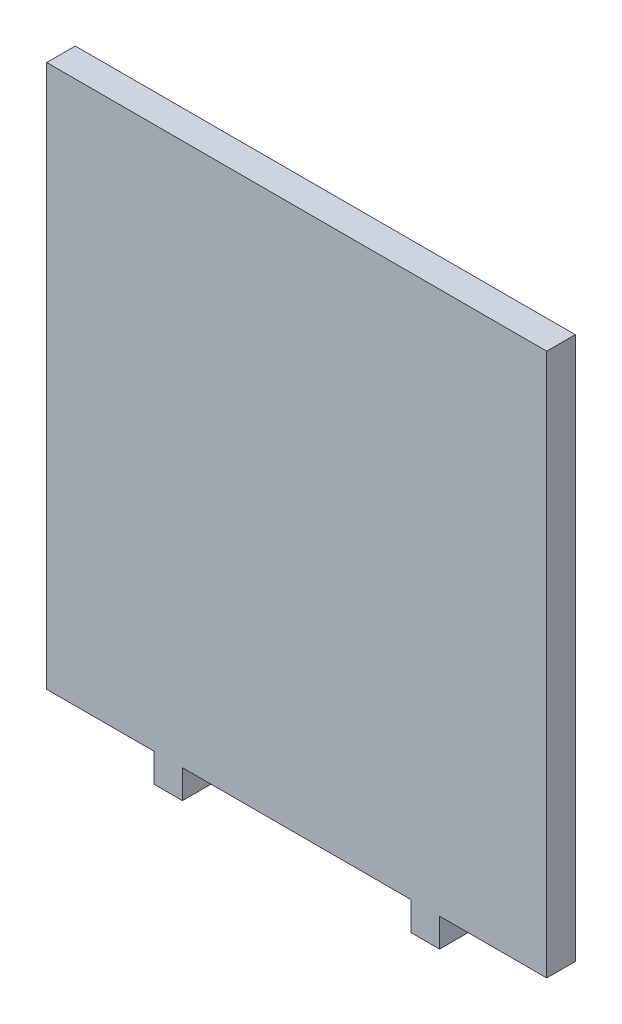
ISO-10303-21;
HEADER;
FILE_DESCRIPTION(('STEP AP214'),'2;1');
FILE_NAME('part.step','',(''),(''),'','','');
FILE_SCHEMA(('AUTOMOTIVE_DESIGN { 1 0 10303 214 1 1 1 1 }'));
ENDSEC;
DATA;
#1=APPLICATION_CONTEXT('core data for automotive mechanical design processes');
#2=APPLICATION_PROTOCOL_DEFINITION('international standard','automotive_design',2000,#1);
#3=PRODUCT_CONTEXT('',#1,'mechanical');
#4=PRODUCT('Part','Part','',(#3));
#5=PRODUCT_RELATED_PRODUCT_CATEGORY('part','',(#4));
#6=PRODUCT_DEFINITION_FORMATION('','',#4);
#7=PRODUCT_DEFINITION_CONTEXT('part definition',#1,'design');
#8=PRODUCT_DEFINITION('design','',#6,#7);
#9=PRODUCT_DEFINITION_SHAPE('','',#8);
#10=(LENGTH_UNIT() NAMED_UNIT(*) SI_UNIT(.MILLI.,.METRE.));
#11=(NAMED_UNIT(*) PLANE_ANGLE_UNIT() SI_UNIT($,.RADIAN.));
#12=(NAMED_UNIT(*) SI_UNIT($,.STERADIAN.) SOLID_ANGLE_UNIT());
#13=UNCERTAINTY_MEASURE_WITH_UNIT(LENGTH_MEASURE(1.E-05),#10,'distance_accuracy_value','');
#14=(GEOMETRIC_REPRESENTATION_CONTEXT(3) GLOBAL_UNCERTAINTY_ASSIGNED_CONTEXT((#13)) GLOBAL_UNIT_ASSIGNED_CONTEXT((#10,
#11,#12)) REPRESENTATION_CONTEXT('',''));
#15=CARTESIAN_POINT('',(0.,0.,0.));
#16=DIRECTION('',(0.,0.,1.));
#17=DIRECTION('',(1.,0.,0.));
#18=AXIS2_PLACEMENT_3D('',#15,#16,#17);
#19=CARTESIAN_POINT('',(-35.,-38.,4.));
#20=DIRECTION('',(1.,0.,0.));
#21=DIRECTION('',(0.,0.,-1.));
#22=AXIS2_PLACEMENT_3D('',#19,#20,#21);
#23=PLANE('',#22);
#24=DIRECTION('',(0.,-1.,0.));
#25=VECTOR('',#24,1.);
#26=CARTESIAN_POINT('',(-35.,-38.,0.));
#27=LINE('',#26,#25);
#28=CARTESIAN_POINT('',(-35.,38.,0.));
#29=VERTEX_POINT('',#28);
#30=CARTESIAN_POINT('',(-35.,-38.,0.));
#31=VERTEX_POINT('',#30);
#32=EDGE_CURVE('E153',#29,#31,#27,.T.);
#33=ORIENTED_EDGE('',*,*,#32,.T.);
#34=DIRECTION('',(0.,0.,-1.));
#35=VECTOR('',#34,1.);
#36=CARTESIAN_POINT('',(-35.,-38.,4.));
#37=LINE('',#36,#35);
#38=CARTESIAN_POINT('',(-35.,-38.,4.));
#39=VERTEX_POINT('',#38);
#40=EDGE_CURVE('E11',#39,#31,#37,.T.);
#41=ORIENTED_EDGE('',*,*,#40,.F.);
#42=DIRECTION('',(0.,-1.,0.));
#43=VECTOR('',#42,1.);
#44=CARTESIAN_POINT('',(-35.,-38.,4.));
#45=LINE('',#44,#43);
#46=CARTESIAN_POINT('',(-35.,38.,4.));
#47=VERTEX_POINT('',#46);
#48=EDGE_CURVE('E175',#47,#39,#45,.T.);
#49=ORIENTED_EDGE('',*,*,#48,.F.);
#50=DIRECTION('',(0.,0.,-1.));
#51=VECTOR('',#50,1.);
#52=CARTESIAN_POINT('',(-35.,38.,4.));
#53=LINE('',#52,#51);
#54=EDGE_CURVE('E149',#47,#29,#53,.T.);
#55=ORIENTED_EDGE('',*,*,#54,.T.);
#56=EDGE_LOOP('',(#33,#41,#49,#55));
#57=FACE_BOUND('',#56,.T.);
#58=ADVANCED_FACE('F33',(#57),#23,.F.);
#59=CARTESIAN_POINT('',(-20.,-38.,4.));
#60=DIRECTION('',(0.,1.,0.));
#61=DIRECTION('',(-1.,0.,0.));
#62=AXIS2_PLACEMENT_3D('',#59,#60,#61);
#63=PLANE('',#62);
#64=DIRECTION('',(1.,0.,0.));
#65=VECTOR('',#64,1.);
#66=CARTESIAN_POINT('',(-20.,-38.,0.));
#67=LINE('',#66,#65);
#68=CARTESIAN_POINT('',(-20.,-38.,0.));
#69=VERTEX_POINT('',#68);
#70=EDGE_CURVE('E156',#31,#69,#67,.T.);
#71=ORIENTED_EDGE('',*,*,#70,.T.);
#72=DIRECTION('',(0.,0.,-1.));
#73=VECTOR('',#72,1.);
#74=CARTESIAN_POINT('',(-20.,-38.,4.));
#75=LINE('',#74,#73);
#76=CARTESIAN_POINT('',(-20.,-38.,4.));
#77=VERTEX_POINT('',#76);
#78=EDGE_CURVE('E41',#77,#69,#75,.T.);
#79=ORIENTED_EDGE('',*,*,#78,.F.);
#80=DIRECTION('',(1.,0.,0.));
#81=VECTOR('',#80,1.);
#82=CARTESIAN_POINT('',(-20.,-38.,4.));
#83=LINE('',#82,#81);
#84=EDGE_CURVE('E104',#39,#77,#83,.T.);
#85=ORIENTED_EDGE('',*,*,#84,.F.);
#86=ORIENTED_EDGE('',*,*,#40,.T.);
#87=EDGE_LOOP('',(#71,#79,#85,#86));
#88=FACE_BOUND('',#87,.T.);
#89=ADVANCED_FACE('F253',(#88),#63,.F.);
#90=CARTESIAN_POINT('',(-20.,-38.,4.));
#91=DIRECTION('',(1.,0.,0.));
#92=DIRECTION('',(0.,0.,-1.));
#93=AXIS2_PLACEMENT_3D('',#90,#91,#92);
#94=PLANE('',#93);
#95=DIRECTION('',(0.,-1.,0.));
#96=VECTOR('',#95,1.);
#97=CARTESIAN_POINT('',(-20.,-38.,0.));
#98=LINE('',#97,#96);
#99=CARTESIAN_POINT('',(-20.,-42.,0.));
#100=VERTEX_POINT('',#99);
#101=EDGE_CURVE('E158',#69,#100,#98,.T.);
#102=ORIENTED_EDGE('',*,*,#101,.T.);
#103=DIRECTION('',(0.,0.,-1.));
#104=VECTOR('',#103,1.);
#105=CARTESIAN_POINT('',(-20.,-42.,4.));
#106=LINE('',#105,#104);
#107=CARTESIAN_POINT('',(-20.,-42.,4.));
#108=VERTEX_POINT('',#107);
#109=EDGE_CURVE('E194',#108,#100,#106,.T.);
#110=ORIENTED_EDGE('',*,*,#109,.F.);
#111=DIRECTION('',(0.,-1.,0.));
#112=VECTOR('',#111,1.);
#113=CARTESIAN_POINT('',(-20.,-38.,4.));
#114=LINE('',#113,#112);
#115=EDGE_CURVE('E202',#77,#108,#114,.T.);
#116=ORIENTED_EDGE('',*,*,#115,.F.);
#117=ORIENTED_EDGE('',*,*,#78,.T.);
#118=EDGE_LOOP('',(#102,#110,#116,#117));
#119=FACE_BOUND('',#118,.T.);
#120=ADVANCED_FACE('F200',(#119),#94,.F.);
#121=CARTESIAN_POINT('',(-20.,-42.,4.));
#122=DIRECTION('',(0.,1.,0.));
#123=DIRECTION('',(-1.,0.,0.));
#124=AXIS2_PLACEMENT_3D('',#121,#122,#123);
#125=PLANE('',#124);
#126=DIRECTION('',(1.,0.,0.));
#127=VECTOR('',#126,1.);
#128=CARTESIAN_POINT('',(-20.,-42.,0.));
#129=LINE('',#128,#127);
#130=CARTESIAN_POINT('',(-16.,-42.,0.));
#131=VERTEX_POINT('',#130);
#132=EDGE_CURVE('E160',#100,#131,#129,.T.);
#133=ORIENTED_EDGE('',*,*,#132,.T.);
#134=DIRECTION('',(0.,0.,-1.));
#135=VECTOR('',#134,1.);
#136=CARTESIAN_POINT('',(-16.,-42.,4.));
#137=LINE('',#136,#135);
#138=CARTESIAN_POINT('',(-16.,-42.,4.));
#139=VERTEX_POINT('',#138);
#140=EDGE_CURVE('E191',#139,#131,#137,.T.);
#141=ORIENTED_EDGE('',*,*,#140,.F.);
#142=DIRECTION('',(1.,0.,0.));
#143=VECTOR('',#142,1.);
#144=CARTESIAN_POINT('',(-20.,-42.,4.));
#145=LINE('',#144,#143);
#146=EDGE_CURVE('E220',#108,#139,#145,.T.);
#147=ORIENTED_EDGE('',*,*,#146,.F.);
#148=ORIENTED_EDGE('',*,*,#109,.T.);
#149=EDGE_LOOP('',(#133,#141,#147,#148));
#150=FACE_BOUND('',#149,.T.);
#151=ADVANCED_FACE('F211',(#150),#125,.F.);
#152=CARTESIAN_POINT('',(-16.,-38.,4.));
#153=DIRECTION('',(-1.,0.,0.));
#154=DIRECTION('',(0.,0.,1.));
#155=AXIS2_PLACEMENT_3D('',#152,#153,#154);
#156=PLANE('',#155);
#157=DIRECTION('',(0.,1.,0.));
#158=VECTOR('',#157,1.);
#159=CARTESIAN_POINT('',(-16.,-38.,0.));
#160=LINE('',#159,#158);
#161=CARTESIAN_POINT('',(-16.,-38.,0.));
#162=VERTEX_POINT('',#161);
#163=EDGE_CURVE('E162',#131,#162,#160,.T.);
#164=ORIENTED_EDGE('',*,*,#163,.T.);
#165=DIRECTION('',(0.,0.,-1.));
#166=VECTOR('',#165,1.);
#167=CARTESIAN_POINT('',(-16.,-38.,4.));
#168=LINE('',#167,#166);
#169=CARTESIAN_POINT('',(-16.,-38.,4.));
#170=VERTEX_POINT('',#169);
#171=EDGE_CURVE('E188',#170,#162,#168,.T.);
#172=ORIENTED_EDGE('',*,*,#171,.F.);
#173=DIRECTION('',(0.,1.,0.));
#174=VECTOR('',#173,1.);
#175=CARTESIAN_POINT('',(-16.,-38.,4.));
#176=LINE('',#175,#174);
#177=EDGE_CURVE('E217',#139,#170,#176,.T.);
#178=ORIENTED_EDGE('',*,*,#177,.F.);
#179=ORIENTED_EDGE('',*,*,#140,.T.);
#180=EDGE_LOOP('',(#164,#172,#178,#179));
#181=FACE_BOUND('',#180,.T.);
#182=ADVANCED_FACE('F215',(#181),#156,.F.);
#183=CARTESIAN_POINT('',(16.,-38.,4.));
#184=DIRECTION('',(0.,1.,0.));
#185=DIRECTION('',(0.,0.,1.));
#186=AXIS2_PLACEMENT_3D('',#183,#184,#185);
#187=PLANE('',#186);
#188=DIRECTION('',(1.,0.,0.));
#189=VECTOR('',#188,1.);
#190=CARTESIAN_POINT('',(16.,-38.,0.));
#191=LINE('',#190,#189);
#192=CARTESIAN_POINT('',(16.,-38.,0.));
#193=VERTEX_POINT('',#192);
#194=EDGE_CURVE('E164',#162,#193,#191,.T.);
#195=ORIENTED_EDGE('',*,*,#194,.T.);
#196=DIRECTION('',(0.,0.,-1.));
#197=VECTOR('',#196,1.);
#198=CARTESIAN_POINT('',(16.,-38.,4.));
#199=LINE('',#198,#197);
#200=CARTESIAN_POINT('',(16.,-38.,4.));
#201=VERTEX_POINT('',#200);
#202=EDGE_CURVE('E185',#201,#193,#199,.T.);
#203=ORIENTED_EDGE('',*,*,#202,.F.);
#204=DIRECTION('',(1.,0.,0.));
#205=VECTOR('',#204,1.);
#206=CARTESIAN_POINT('',(16.,-38.,4.));
#207=LINE('',#206,#205);
#208=EDGE_CURVE('E219',#170,#201,#207,.T.);
#209=ORIENTED_EDGE('',*,*,#208,.F.);
#210=ORIENTED_EDGE('',*,*,#171,.T.);
#211=EDGE_LOOP('',(#195,#203,#209,#210));
#212=FACE_BOUND('',#211,.T.);
#213=ADVANCED_FACE('F266',(#212),#187,.F.);
#214=CARTESIAN_POINT('',(16.,-38.,4.));
#215=DIRECTION('',(1.,0.,0.));
#216=DIRECTION('',(0.,0.,-1.));
#217=AXIS2_PLACEMENT_3D('',#214,#215,#216);
#218=PLANE('',#217);
#219=DIRECTION('',(0.,-1.,0.));
#220=VECTOR('',#219,1.);
#221=CARTESIAN_POINT('',(16.,-38.,0.));
#222=LINE('',#221,#220);
#223=CARTESIAN_POINT('',(16.,-42.,0.));
#224=VERTEX_POINT('',#223);
#225=EDGE_CURVE('E166',#193,#224,#222,.T.);
#226=ORIENTED_EDGE('',*,*,#225,.T.);
#227=DIRECTION('',(0.,0.,-1.));
#228=VECTOR('',#227,1.);
#229=CARTESIAN_POINT('',(16.,-42.,4.));
#230=LINE('',#229,#228);
#231=CARTESIAN_POINT('',(16.,-42.,4.));
#232=VERTEX_POINT('',#231);
#233=EDGE_CURVE('E182',#232,#224,#230,.T.);
#234=ORIENTED_EDGE('',*,*,#233,.F.);
#235=DIRECTION('',(0.,-1.,0.));
#236=VECTOR('',#235,1.);
#237=CARTESIAN_POINT('',(16.,-38.,4.));
#238=LINE('',#237,#236);
#239=EDGE_CURVE('E222',#201,#232,#238,.T.);
#240=ORIENTED_EDGE('',*,*,#239,.F.);
#241=ORIENTED_EDGE('',*,*,#202,.T.);
#242=EDGE_LOOP('',(#226,#234,#240,#241));
#243=FACE_BOUND('',#242,.T.);
#244=ADVANCED_FACE('F269',(#243),#218,.F.);
#245=CARTESIAN_POINT('',(20.,-42.,4.));
#246=DIRECTION('',(0.,1.,0.));
#247=DIRECTION('',(0.,0.,1.));
#248=AXIS2_PLACEMENT_3D('',#245,#246,#247);
#249=PLANE('',#248);
#250=DIRECTION('',(1.,0.,0.));
#251=VECTOR('',#250,1.);
#252=CARTESIAN_POINT('',(20.,-42.,0.));
#253=LINE('',#252,#251);
#254=CARTESIAN_POINT('',(20.,-42.,0.));
#255=VERTEX_POINT('',#254);
#256=EDGE_CURVE('E168',#224,#255,#253,.T.);
#257=ORIENTED_EDGE('',*,*,#256,.T.);
#258=DIRECTION('',(0.,0.,-1.));
#259=VECTOR('',#258,1.);
#260=CARTESIAN_POINT('',(20.,-42.,4.));
#261=LINE('',#260,#259);
#262=CARTESIAN_POINT('',(20.,-42.,4.));
#263=VERTEX_POINT('',#262);
#264=EDGE_CURVE('E179',#263,#255,#261,.T.);
#265=ORIENTED_EDGE('',*,*,#264,.F.);
#266=DIRECTION('',(1.,0.,0.));
#267=VECTOR('',#266,1.);
#268=CARTESIAN_POINT('',(20.,-42.,4.));
#269=LINE('',#268,#267);
#270=EDGE_CURVE('E228',#232,#263,#269,.T.);
#271=ORIENTED_EDGE('',*,*,#270,.F.);
#272=ORIENTED_EDGE('',*,*,#233,.T.);
#273=EDGE_LOOP('',(#257,#265,#271,#272));
#274=FACE_BOUND('',#273,.T.);
#275=ADVANCED_FACE('F234',(#274),#249,.F.);
#276=CARTESIAN_POINT('',(20.,-38.,4.));
#277=DIRECTION('',(-1.,0.,0.));
#278=DIRECTION('',(0.,0.,1.));
#279=AXIS2_PLACEMENT_3D('',#276,#277,#278);
#280=PLANE('',#279);
#281=DIRECTION('',(0.,1.,0.));
#282=VECTOR('',#281,1.);
#283=CARTESIAN_POINT('',(20.,-38.,0.));
#284=LINE('',#283,#282);
#285=CARTESIAN_POINT('',(20.,-38.,0.));
#286=VERTEX_POINT('',#285);
#287=EDGE_CURVE('E170',#255,#286,#284,.T.);
#288=ORIENTED_EDGE('',*,*,#287,.T.);
#289=DIRECTION('',(0.,0.,-1.));
#290=VECTOR('',#289,1.);
#291=CARTESIAN_POINT('',(20.,-38.,4.));
#292=LINE('',#291,#290);
#293=CARTESIAN_POINT('',(20.,-38.,4.));
#294=VERTEX_POINT('',#293);
#295=EDGE_CURVE('E144',#294,#286,#292,.T.);
#296=ORIENTED_EDGE('',*,*,#295,.F.);
#297=DIRECTION('',(0.,1.,0.));
#298=VECTOR('',#297,1.);
#299=CARTESIAN_POINT('',(20.,-38.,4.));
#300=LINE('',#299,#298);
#301=EDGE_CURVE('E135',#263,#294,#300,.T.);
#302=ORIENTED_EDGE('',*,*,#301,.F.);
#303=ORIENTED_EDGE('',*,*,#264,.T.);
#304=EDGE_LOOP('',(#288,#296,#302,#303));
#305=FACE_BOUND('',#304,.T.);
#306=ADVANCED_FACE('F238',(#305),#280,.F.);
#307=CARTESIAN_POINT('',(35.,-38.,4.));
#308=DIRECTION('',(0.,1.,0.));
#309=DIRECTION('',(0.,0.,1.));
#310=AXIS2_PLACEMENT_3D('',#307,#308,#309);
#311=PLANE('',#310);
#312=DIRECTION('',(1.,0.,0.));
#313=VECTOR('',#312,1.);
#314=CARTESIAN_POINT('',(35.,-38.,0.));
#315=LINE('',#314,#313);
#316=CARTESIAN_POINT('',(35.,-38.,0.));
#317=VERTEX_POINT('',#316);
#318=EDGE_CURVE('E143',#286,#317,#315,.T.);
#319=ORIENTED_EDGE('',*,*,#318,.T.);
#320=DIRECTION('',(0.,0.,-1.));
#321=VECTOR('',#320,1.);
#322=CARTESIAN_POINT('',(35.,-38.,4.));
#323=LINE('',#322,#321);
#324=CARTESIAN_POINT('',(35.,-38.,4.));
#325=VERTEX_POINT('',#324);
#326=EDGE_CURVE('E140',#325,#317,#323,.T.);
#327=ORIENTED_EDGE('',*,*,#326,.F.);
#328=DIRECTION('',(1.,0.,0.));
#329=VECTOR('',#328,1.);
#330=CARTESIAN_POINT('',(35.,-38.,4.));
#331=LINE('',#330,#329);
#332=EDGE_CURVE('E129',#294,#325,#331,.T.);
#333=ORIENTED_EDGE('',*,*,#332,.F.);
#334=ORIENTED_EDGE('',*,*,#295,.T.);
#335=EDGE_LOOP('',(#319,#327,#333,#334));
#336=FACE_BOUND('',#335,.T.);
#337=ADVANCED_FACE('F141',(#336),#311,.F.);
#338=CARTESIAN_POINT('',(35.,-38.,4.));
#339=DIRECTION('',(-1.,0.,0.));
#340=DIRECTION('',(0.,0.,1.));
#341=AXIS2_PLACEMENT_3D('',#338,#339,#340);
#342=PLANE('',#341);
#343=DIRECTION('',(0.,1.,0.));
#344=VECTOR('',#343,1.);
#345=CARTESIAN_POINT('',(35.,-38.,0.));
#346=LINE('',#345,#344);
#347=CARTESIAN_POINT('',(35.,38.,0.));
#348=VERTEX_POINT('',#347);
#349=EDGE_CURVE('E90',#317,#348,#346,.T.);
#350=ORIENTED_EDGE('',*,*,#349,.T.);
#351=DIRECTION('',(0.,0.,-1.));
#352=VECTOR('',#351,1.);
#353=CARTESIAN_POINT('',(35.,38.,4.));
#354=LINE('',#353,#352);
#355=CARTESIAN_POINT('',(35.,38.,4.));
#356=VERTEX_POINT('',#355);
#357=EDGE_CURVE('E145',#356,#348,#354,.T.);
#358=ORIENTED_EDGE('',*,*,#357,.F.);
#359=DIRECTION('',(0.,1.,0.));
#360=VECTOR('',#359,1.);
#361=CARTESIAN_POINT('',(35.,-38.,4.));
#362=LINE('',#361,#360);
#363=EDGE_CURVE('E133',#325,#356,#362,.T.);
#364=ORIENTED_EDGE('',*,*,#363,.F.);
#365=ORIENTED_EDGE('',*,*,#326,.T.);
#366=EDGE_LOOP('',(#350,#358,#364,#365));
#367=FACE_BOUND('',#366,.T.);
#368=ADVANCED_FACE('F147',(#367),#342,.F.);
#369=CARTESIAN_POINT('',(35.,38.,4.));
#370=DIRECTION('',(0.,-1.,0.));
#371=DIRECTION('',(1.,0.,0.));
#372=AXIS2_PLACEMENT_3D('',#369,#370,#371);
#373=PLANE('',#372);
#374=DIRECTION('',(-1.,0.,0.));
#375=VECTOR('',#374,1.);
#376=CARTESIAN_POINT('',(35.,38.,0.));
#377=LINE('',#376,#375);
#378=EDGE_CURVE('E96',#348,#29,#377,.T.);
#379=ORIENTED_EDGE('',*,*,#378,.T.);
#380=ORIENTED_EDGE('',*,*,#54,.F.);
#381=DIRECTION('',(-1.,0.,0.));
#382=VECTOR('',#381,1.);
#383=CARTESIAN_POINT('',(35.,38.,4.));
#384=LINE('',#383,#382);
#385=EDGE_CURVE('E49',#356,#47,#384,.T.);
#386=ORIENTED_EDGE('',*,*,#385,.F.);
#387=ORIENTED_EDGE('',*,*,#357,.T.);
#388=EDGE_LOOP('',(#379,#380,#386,#387));
#389=FACE_BOUND('',#388,.T.);
#390=ADVANCED_FACE('F242',(#389),#373,.F.);
#391=CARTESIAN_POINT('',(0.,0.,4.));
#392=DIRECTION('',(0.,0.,1.));
#393=DIRECTION('',(1.,0.,0.));
#394=AXIS2_PLACEMENT_3D('',#391,#392,#393);
#395=PLANE('',#394);
#396=ORIENTED_EDGE('',*,*,#48,.T.);
#397=ORIENTED_EDGE('',*,*,#84,.T.);
#398=ORIENTED_EDGE('',*,*,#115,.T.);
#399=ORIENTED_EDGE('',*,*,#146,.T.);
#400=ORIENTED_EDGE('',*,*,#177,.T.);
#401=ORIENTED_EDGE('',*,*,#208,.T.);
#402=ORIENTED_EDGE('',*,*,#239,.T.);
#403=ORIENTED_EDGE('',*,*,#270,.T.);
#404=ORIENTED_EDGE('',*,*,#301,.T.);
#405=ORIENTED_EDGE('',*,*,#332,.T.);
#406=ORIENTED_EDGE('',*,*,#363,.T.);
#407=ORIENTED_EDGE('',*,*,#385,.T.);
#408=EDGE_LOOP('',(#396,#397,#398,#399,#400,#401,#402,#403,#404,#405,#406,#407));
#409=FACE_BOUND('',#408,.T.);
#410=ADVANCED_FACE('F131',(#409),#395,.T.);
#411=CARTESIAN_POINT('',(0.,0.,0.));
#412=DIRECTION('',(0.,0.,1.));
#413=DIRECTION('',(1.,0.,0.));
#414=AXIS2_PLACEMENT_3D('',#411,#412,#413);
#415=PLANE('',#414);
#416=ORIENTED_EDGE('',*,*,#32,.F.);
#417=ORIENTED_EDGE('',*,*,#378,.F.);
#418=ORIENTED_EDGE('',*,*,#349,.F.);
#419=ORIENTED_EDGE('',*,*,#318,.F.);
#420=ORIENTED_EDGE('',*,*,#287,.F.);
#421=ORIENTED_EDGE('',*,*,#256,.F.);
#422=ORIENTED_EDGE('',*,*,#225,.F.);
#423=ORIENTED_EDGE('',*,*,#194,.F.);
#424=ORIENTED_EDGE('',*,*,#163,.F.);
#425=ORIENTED_EDGE('',*,*,#132,.F.);
#426=ORIENTED_EDGE('',*,*,#101,.F.);
#427=ORIENTED_EDGE('',*,*,#70,.F.);
#428=EDGE_LOOP('',(#416,#417,#418,#419,#420,#421,#422,#423,#424,#425,#426,#427));
#429=FACE_BOUND('',#428,.T.);
#430=ADVANCED_FACE('F206',(#429),#415,.F.);
#431=CLOSED_SHELL('',(#58,#89,#120,#151,#182,#213,#244,#275,#306,#337,#368,#390,#410,#430));
#432=MANIFOLD_SOLID_BREP('B2',#431);
#433=ADVANCED_BREP_SHAPE_REPRESENTATION('',(#18,#432),#14);
#434=SHAPE_DEFINITION_REPRESENTATION(#9,#433);
ENDSEC;
END-ISO-10303-21;
